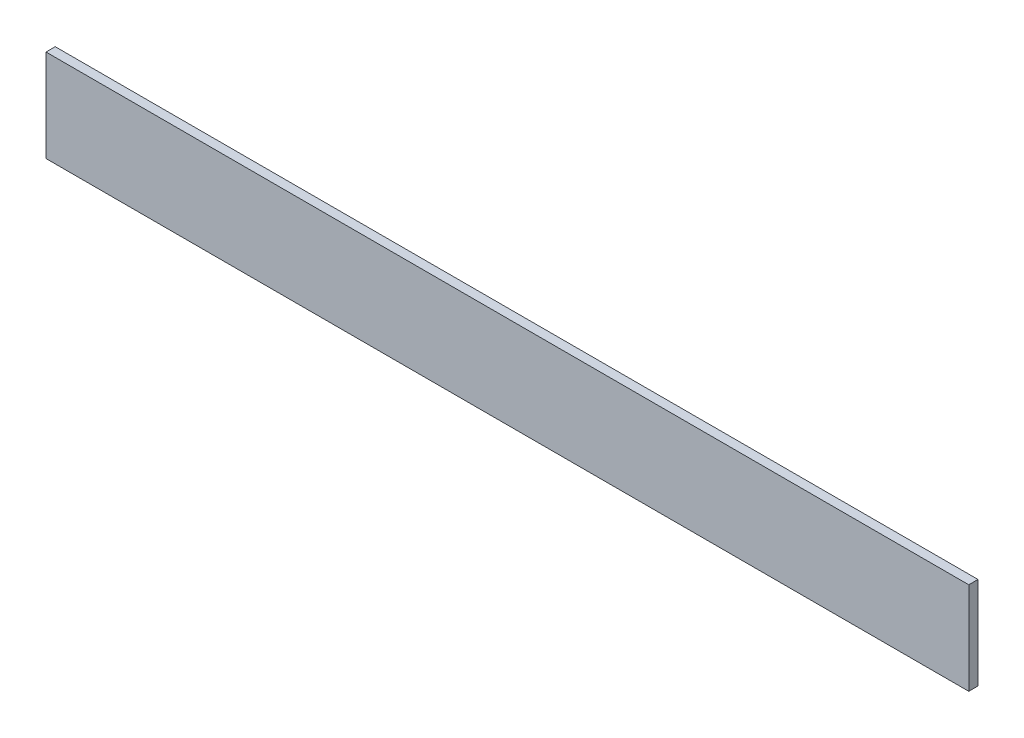
ISO-10303-21;
HEADER;
FILE_DESCRIPTION(('STEP AP214'),'2;1');
FILE_NAME('part.step','',(''),(''),'','','');
FILE_SCHEMA(('AUTOMOTIVE_DESIGN { 1 0 10303 214 1 1 1 1 }'));
ENDSEC;
DATA;
#1=APPLICATION_CONTEXT('core data for automotive mechanical design processes');
#2=APPLICATION_PROTOCOL_DEFINITION('international standard','automotive_design',2000,#1);
#3=PRODUCT_CONTEXT('',#1,'mechanical');
#4=PRODUCT('Part','Part','',(#3));
#5=PRODUCT_RELATED_PRODUCT_CATEGORY('part','',(#4));
#6=PRODUCT_DEFINITION_FORMATION('','',#4);
#7=PRODUCT_DEFINITION_CONTEXT('part definition',#1,'design');
#8=PRODUCT_DEFINITION('design','',#6,#7);
#9=PRODUCT_DEFINITION_SHAPE('','',#8);
#10=(LENGTH_UNIT() NAMED_UNIT(*) SI_UNIT(.MILLI.,.METRE.));
#11=(NAMED_UNIT(*) PLANE_ANGLE_UNIT() SI_UNIT($,.RADIAN.));
#12=(NAMED_UNIT(*) SI_UNIT($,.STERADIAN.) SOLID_ANGLE_UNIT());
#13=UNCERTAINTY_MEASURE_WITH_UNIT(LENGTH_MEASURE(1.E-05),#10,'distance_accuracy_value','');
#14=(GEOMETRIC_REPRESENTATION_CONTEXT(3) GLOBAL_UNCERTAINTY_ASSIGNED_CONTEXT((#13)) GLOBAL_UNIT_ASSIGNED_CONTEXT((#10,
#11,#12)) REPRESENTATION_CONTEXT('',''));
#15=CARTESIAN_POINT('',(0.,0.,0.));
#16=DIRECTION('',(0.,0.,1.));
#17=DIRECTION('',(1.,0.,0.));
#18=AXIS2_PLACEMENT_3D('',#15,#16,#17);
#19=CARTESIAN_POINT('',(500.,-5.,-5.));
#20=DIRECTION('',(0.,-1.,0.));
#21=DIRECTION('',(0.,0.,-1.));
#22=AXIS2_PLACEMENT_3D('',#19,#20,#21);
#23=PLANE('',#22);
#24=DIRECTION('',(0.,0.,1.));
#25=VECTOR('',#24,1.);
#26=CARTESIAN_POINT('',(0.,-5.,-5.));
#27=LINE('',#26,#25);
#28=CARTESIAN_POINT('',(0.,-5.,-5.));
#29=VERTEX_POINT('',#28);
#30=CARTESIAN_POINT('',(0.,-5.,0.));
#31=VERTEX_POINT('',#30);
#32=EDGE_CURVE('E97',#29,#31,#27,.T.);
#33=ORIENTED_EDGE('',*,*,#32,.T.);
#34=DIRECTION('',(-1.,0.,0.));
#35=VECTOR('',#34,1.);
#36=CARTESIAN_POINT('',(500.,-5.,0.));
#37=LINE('',#36,#35);
#38=CARTESIAN_POINT('',(500.,-5.,0.));
#39=VERTEX_POINT('',#38);
#40=EDGE_CURVE('E11',#39,#31,#37,.T.);
#41=ORIENTED_EDGE('',*,*,#40,.F.);
#42=DIRECTION('',(0.,0.,1.));
#43=VECTOR('',#42,1.);
#44=CARTESIAN_POINT('',(500.,-5.,-5.));
#45=LINE('',#44,#43);
#46=CARTESIAN_POINT('',(500.,-5.,-5.));
#47=VERTEX_POINT('',#46);
#48=EDGE_CURVE('E83',#47,#39,#45,.T.);
#49=ORIENTED_EDGE('',*,*,#48,.F.);
#50=DIRECTION('',(-1.,0.,0.));
#51=VECTOR('',#50,1.);
#52=CARTESIAN_POINT('',(500.,-5.,-5.));
#53=LINE('',#52,#51);
#54=EDGE_CURVE('E93',#47,#29,#53,.T.);
#55=ORIENTED_EDGE('',*,*,#54,.T.);
#56=EDGE_LOOP('',(#33,#41,#49,#55));
#57=FACE_BOUND('',#56,.T.);
#58=ADVANCED_FACE('F33',(#57),#23,.F.);
#59=CARTESIAN_POINT('',(500.,-5.,0.));
#60=DIRECTION('',(0.,0.,-1.));
#61=DIRECTION('',(-1.,0.,0.));
#62=AXIS2_PLACEMENT_3D('',#59,#60,#61);
#63=PLANE('',#62);
#64=DIRECTION('',(0.,-1.,0.));
#65=VECTOR('',#64,1.);
#66=CARTESIAN_POINT('',(0.,-5.,0.));
#67=LINE('',#66,#65);
#68=CARTESIAN_POINT('',(0.,-55.,0.));
#69=VERTEX_POINT('',#68);
#70=EDGE_CURVE('E88',#31,#69,#67,.T.);
#71=ORIENTED_EDGE('',*,*,#70,.T.);
#72=DIRECTION('',(-1.,0.,0.));
#73=VECTOR('',#72,1.);
#74=CARTESIAN_POINT('',(500.,-55.,0.));
#75=LINE('',#74,#73);
#76=CARTESIAN_POINT('',(500.,-55.,0.));
#77=VERTEX_POINT('',#76);
#78=EDGE_CURVE('E41',#77,#69,#75,.T.);
#79=ORIENTED_EDGE('',*,*,#78,.F.);
#80=DIRECTION('',(0.,-1.,0.));
#81=VECTOR('',#80,1.);
#82=CARTESIAN_POINT('',(500.,-5.,0.));
#83=LINE('',#82,#81);
#84=EDGE_CURVE('E77',#39,#77,#83,.T.);
#85=ORIENTED_EDGE('',*,*,#84,.F.);
#86=ORIENTED_EDGE('',*,*,#40,.T.);
#87=EDGE_LOOP('',(#71,#79,#85,#86));
#88=FACE_BOUND('',#87,.T.);
#89=ADVANCED_FACE('F87',(#88),#63,.F.);
#90=CARTESIAN_POINT('',(500.,-55.,-5.00000000000001));
#91=DIRECTION('',(0.,1.,0.));
#92=DIRECTION('',(0.,0.,1.));
#93=AXIS2_PLACEMENT_3D('',#90,#91,#92);
#94=PLANE('',#93);
#95=DIRECTION('',(0.,0.,-1.));
#96=VECTOR('',#95,1.);
#97=CARTESIAN_POINT('',(0.,-55.,-5.00000000000001));
#98=LINE('',#97,#96);
#99=CARTESIAN_POINT('',(0.,-55.,-5.00000000000001));
#100=VERTEX_POINT('',#99);
#101=EDGE_CURVE('E101',#69,#100,#98,.T.);
#102=ORIENTED_EDGE('',*,*,#101,.T.);
#103=DIRECTION('',(-1.,0.,0.));
#104=VECTOR('',#103,1.);
#105=CARTESIAN_POINT('',(500.,-55.,-5.00000000000001));
#106=LINE('',#105,#104);
#107=CARTESIAN_POINT('',(500.,-55.,-5.00000000000001));
#108=VERTEX_POINT('',#107);
#109=EDGE_CURVE('E90',#108,#100,#106,.T.);
#110=ORIENTED_EDGE('',*,*,#109,.F.);
#111=DIRECTION('',(0.,0.,-1.));
#112=VECTOR('',#111,1.);
#113=CARTESIAN_POINT('',(500.,-55.,-5.00000000000001));
#114=LINE('',#113,#112);
#115=EDGE_CURVE('E80',#77,#108,#114,.T.);
#116=ORIENTED_EDGE('',*,*,#115,.F.);
#117=ORIENTED_EDGE('',*,*,#78,.T.);
#118=EDGE_LOOP('',(#102,#110,#116,#117));
#119=FACE_BOUND('',#118,.T.);
#120=ADVANCED_FACE('F91',(#119),#94,.F.);
#121=CARTESIAN_POINT('',(500.,-15.,-5.));
#122=DIRECTION('',(0.,0.,1.));
#123=DIRECTION('',(0.,-1.,0.));
#124=AXIS2_PLACEMENT_3D('',#121,#122,#123);
#125=PLANE('',#124);
#126=DIRECTION('',(0.,1.,0.));
#127=VECTOR('',#126,1.);
#128=CARTESIAN_POINT('',(0.,-15.,-5.));
#129=LINE('',#128,#127);
#130=EDGE_CURVE('E66',#100,#29,#129,.T.);
#131=ORIENTED_EDGE('',*,*,#130,.T.);
#132=ORIENTED_EDGE('',*,*,#54,.F.);
#133=DIRECTION('',(0.,1.,0.));
#134=VECTOR('',#133,1.);
#135=CARTESIAN_POINT('',(500.,-55.,-5.00000000000001));
#136=LINE('',#135,#134);
#137=EDGE_CURVE('E49',#108,#47,#136,.T.);
#138=ORIENTED_EDGE('',*,*,#137,.F.);
#139=ORIENTED_EDGE('',*,*,#109,.T.);
#140=EDGE_LOOP('',(#131,#132,#138,#139));
#141=FACE_BOUND('',#140,.T.);
#142=ADVANCED_FACE('F105',(#141),#125,.F.);
#143=CARTESIAN_POINT('',(500.,0.,0.));
#144=DIRECTION('',(1.,0.,0.));
#145=DIRECTION('',(0.,0.,-1.));
#146=AXIS2_PLACEMENT_3D('',#143,#144,#145);
#147=PLANE('',#146);
#148=ORIENTED_EDGE('',*,*,#48,.T.);
#149=ORIENTED_EDGE('',*,*,#84,.T.);
#150=ORIENTED_EDGE('',*,*,#115,.T.);
#151=ORIENTED_EDGE('',*,*,#137,.T.);
#152=EDGE_LOOP('',(#148,#149,#150,#151));
#153=FACE_BOUND('',#152,.T.);
#154=ADVANCED_FACE('F78',(#153),#147,.T.);
#155=CARTESIAN_POINT('',(0.,0.,0.));
#156=DIRECTION('',(1.,0.,0.));
#157=DIRECTION('',(0.,0.,-1.));
#158=AXIS2_PLACEMENT_3D('',#155,#156,#157);
#159=PLANE('',#158);
#160=ORIENTED_EDGE('',*,*,#32,.F.);
#161=ORIENTED_EDGE('',*,*,#130,.F.);
#162=ORIENTED_EDGE('',*,*,#101,.F.);
#163=ORIENTED_EDGE('',*,*,#70,.F.);
#164=EDGE_LOOP('',(#160,#161,#162,#163));
#165=FACE_BOUND('',#164,.T.);
#166=ADVANCED_FACE('F107',(#165),#159,.F.);
#167=CLOSED_SHELL('',(#58,#89,#120,#142,#154,#166));
#168=MANIFOLD_SOLID_BREP('B2',#167);
#169=ADVANCED_BREP_SHAPE_REPRESENTATION('',(#18,#168),#14);
#170=SHAPE_DEFINITION_REPRESENTATION(#9,#169);
ENDSEC;
END-ISO-10303-21;
